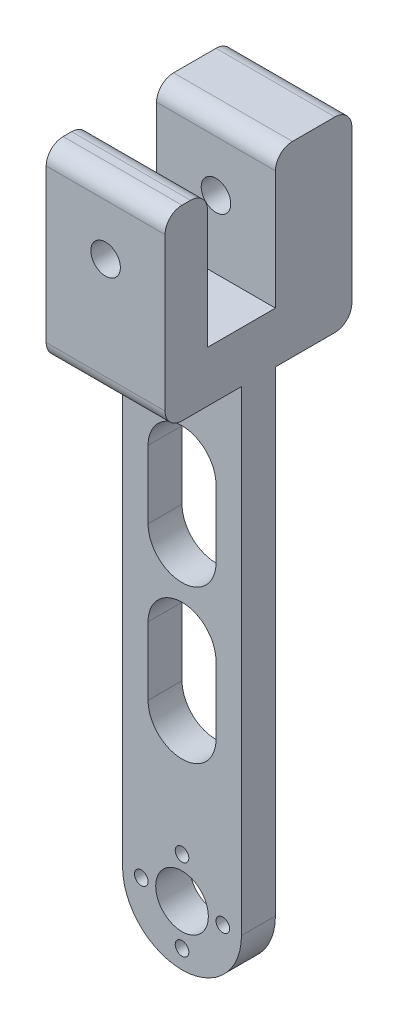
ISO-10303-21;
HEADER;
FILE_DESCRIPTION(('STEP AP214'),'2;1');
FILE_NAME('part.step','',(''),(''),'','','');
FILE_SCHEMA(('AUTOMOTIVE_DESIGN { 1 0 10303 214 1 1 1 1 }'));
ENDSEC;
DATA;
#1=APPLICATION_CONTEXT('core data for automotive mechanical design processes');
#2=APPLICATION_PROTOCOL_DEFINITION('international standard','automotive_design',2000,#1);
#3=PRODUCT_CONTEXT('',#1,'mechanical');
#4=PRODUCT('Part','Part','',(#3));
#5=PRODUCT_RELATED_PRODUCT_CATEGORY('part','',(#4));
#6=PRODUCT_DEFINITION_FORMATION('','',#4);
#7=PRODUCT_DEFINITION_CONTEXT('part definition',#1,'design');
#8=PRODUCT_DEFINITION('design','',#6,#7);
#9=PRODUCT_DEFINITION_SHAPE('','',#8);
#10=(LENGTH_UNIT() NAMED_UNIT(*) SI_UNIT(.MILLI.,.METRE.));
#11=(NAMED_UNIT(*) PLANE_ANGLE_UNIT() SI_UNIT($,.RADIAN.));
#12=(NAMED_UNIT(*) SI_UNIT($,.STERADIAN.) SOLID_ANGLE_UNIT());
#13=UNCERTAINTY_MEASURE_WITH_UNIT(LENGTH_MEASURE(1.E-05),#10,'distance_accuracy_value','');
#14=(GEOMETRIC_REPRESENTATION_CONTEXT(3) GLOBAL_UNCERTAINTY_ASSIGNED_CONTEXT((#13)) GLOBAL_UNIT_ASSIGNED_CONTEXT((#10,
#11,#12)) REPRESENTATION_CONTEXT('',''));
#15=CARTESIAN_POINT('',(0.,0.,0.));
#16=DIRECTION('',(0.,0.,1.));
#17=DIRECTION('',(1.,0.,0.));
#18=AXIS2_PLACEMENT_3D('',#15,#16,#17);
#19=CARTESIAN_POINT('',(17.5,97.5,5.));
#20=DIRECTION('',(0.,-1.,0.));
#21=DIRECTION('',(0.,0.,-1.));
#22=AXIS2_PLACEMENT_3D('',#19,#20,#21);
#23=PLANE('',#22);
#24=DIRECTION('',(-1.,0.,0.));
#25=VECTOR('',#24,1.);
#26=CARTESIAN_POINT('',(67.5,97.5,20.));
#27=LINE('',#26,#25);
#28=CARTESIAN_POINT('',(17.5,97.5,20.));
#29=VERTEX_POINT('',#28);
#30=CARTESIAN_POINT('',(-17.5,97.5,20.));
#31=VERTEX_POINT('',#30);
#32=EDGE_CURVE('E313',#29,#31,#27,.T.);
#33=ORIENTED_EDGE('',*,*,#32,.T.);
#34=DIRECTION('',(0.,0.,-1.));
#35=VECTOR('',#34,1.);
#36=CARTESIAN_POINT('',(-17.5,97.5,5.));
#37=LINE('',#36,#35);
#38=CARTESIAN_POINT('',(-17.5,97.5,22.5));
#39=VERTEX_POINT('',#38);
#40=EDGE_CURVE('E407',#39,#31,#37,.T.);
#41=ORIENTED_EDGE('',*,*,#40,.F.);
#42=DIRECTION('',(-1.,0.,0.));
#43=VECTOR('',#42,1.);
#44=CARTESIAN_POINT('',(17.5,97.5,22.5));
#45=LINE('',#44,#43);
#46=CARTESIAN_POINT('',(17.5,97.5,22.5));
#47=VERTEX_POINT('',#46);
#48=EDGE_CURVE('E345',#47,#39,#45,.T.);
#49=ORIENTED_EDGE('',*,*,#48,.F.);
#50=DIRECTION('',(0.,0.,-1.));
#51=VECTOR('',#50,1.);
#52=CARTESIAN_POINT('',(17.5,97.5,5.));
#53=LINE('',#52,#51);
#54=EDGE_CURVE('E411',#47,#29,#53,.T.);
#55=ORIENTED_EDGE('',*,*,#54,.T.);
#56=EDGE_LOOP('',(#33,#41,#49,#55));
#57=FACE_BOUND('',#56,.T.);
#58=ADVANCED_FACE('F33',(#57),#23,.F.);
#59=CARTESIAN_POINT('',(0.,-97.5,5.));
#60=DIRECTION('',(0.,0.,1.));
#61=DIRECTION('',(1.,0.,0.));
#62=AXIS2_PLACEMENT_3D('',#59,#60,#61);
#63=PLANE('',#62);
#64=CARTESIAN_POINT('',(-12.,-97.5,5.));
#65=DIRECTION('',(0.,0.,1.));
#66=DIRECTION('',(1.,0.,0.));
#67=AXIS2_PLACEMENT_3D('',#64,#65,#66);
#68=CIRCLE('',#67,2.);
#69=CARTESIAN_POINT('',(-10.,-97.5,5.));
#70=VERTEX_POINT('',#69);
#71=EDGE_CURVE('E234',#70,#70,#68,.T.);
#72=ORIENTED_EDGE('',*,*,#71,.F.);
#73=EDGE_LOOP('',(#72));
#74=FACE_BOUND('',#73,.T.);
#75=CARTESIAN_POINT('',(0.,-109.5,5.));
#76=DIRECTION('',(0.,0.,1.));
#77=DIRECTION('',(1.,0.,0.));
#78=AXIS2_PLACEMENT_3D('',#75,#76,#77);
#79=CIRCLE('',#78,1.99999999999999);
#80=CARTESIAN_POINT('',(2.00000000000003,-109.5,5.));
#81=VERTEX_POINT('',#80);
#82=EDGE_CURVE('E859',#81,#81,#79,.T.);
#83=ORIENTED_EDGE('',*,*,#82,.F.);
#84=EDGE_LOOP('',(#83));
#85=FACE_BOUND('',#84,.T.);
#86=CARTESIAN_POINT('',(12.,-97.4999999999999,5.));
#87=DIRECTION('',(0.,0.,1.));
#88=DIRECTION('',(1.,0.,0.));
#89=AXIS2_PLACEMENT_3D('',#86,#87,#88);
#90=CIRCLE('',#89,2.);
#91=CARTESIAN_POINT('',(14.,-97.4999999999999,5.));
#92=VERTEX_POINT('',#91);
#93=EDGE_CURVE('E857',#92,#92,#90,.T.);
#94=ORIENTED_EDGE('',*,*,#93,.F.);
#95=EDGE_LOOP('',(#94));
#96=FACE_BOUND('',#95,.T.);
#97=CARTESIAN_POINT('',(-1.2490009027033E-13,-85.5,5.));
#98=DIRECTION('',(0.,0.,1.));
#99=DIRECTION('',(1.,0.,0.));
#100=AXIS2_PLACEMENT_3D('',#97,#98,#99);
#101=CIRCLE('',#100,1.99999999999999);
#102=CARTESIAN_POINT('',(1.99999999999986,-85.5,5.));
#103=VERTEX_POINT('',#102);
#104=EDGE_CURVE('E854',#103,#103,#101,.T.);
#105=ORIENTED_EDGE('',*,*,#104,.F.);
#106=EDGE_LOOP('',(#105));
#107=FACE_BOUND('',#106,.T.);
#108=CARTESIAN_POINT('',(0.,-97.5,5.));
#109=DIRECTION('',(0.,0.,1.));
#110=DIRECTION('',(1.,0.,0.));
#111=AXIS2_PLACEMENT_3D('',#108,#109,#110);
#112=CIRCLE('',#111,7.75);
#113=CARTESIAN_POINT('',(7.75,-97.5,5.));
#114=VERTEX_POINT('',#113);
#115=EDGE_CURVE('E843',#114,#114,#112,.T.);
#116=ORIENTED_EDGE('',*,*,#115,.F.);
#117=EDGE_LOOP('',(#116));
#118=FACE_BOUND('',#117,.T.);
#119=CARTESIAN_POINT('',(0.,13.7561815674927,5.));
#120=DIRECTION('',(0.,0.,1.));
#121=DIRECTION('',(1.,0.,0.));
#122=AXIS2_PLACEMENT_3D('',#119,#120,#121);
#123=CIRCLE('',#122,10.);
#124=CARTESIAN_POINT('',(10.,13.7561815674927,5.));
#125=VERTEX_POINT('',#124);
#126=CARTESIAN_POINT('',(-10.,13.7561815674927,5.));
#127=VERTEX_POINT('',#126);
#128=EDGE_CURVE('E49',#125,#127,#123,.T.);
#129=ORIENTED_EDGE('',*,*,#128,.F.);
#130=DIRECTION('',(0.,1.,0.));
#131=VECTOR('',#130,1.);
#132=CARTESIAN_POINT('',(10.,13.7561815674927,5.));
#133=LINE('',#132,#131);
#134=CARTESIAN_POINT('',(10.,-6.24381843250733,5.));
#135=VERTEX_POINT('',#134);
#136=EDGE_CURVE('E228',#135,#125,#133,.T.);
#137=ORIENTED_EDGE('',*,*,#136,.F.);
#138=CARTESIAN_POINT('',(0.,-6.24381843250733,5.));
#139=DIRECTION('',(0.,0.,1.));
#140=DIRECTION('',(1.,0.,0.));
#141=AXIS2_PLACEMENT_3D('',#138,#139,#140);
#142=CIRCLE('',#141,10.);
#143=CARTESIAN_POINT('',(-9.99999999999999,-6.24381843250733,5.));
#144=VERTEX_POINT('',#143);
#145=EDGE_CURVE('E231',#144,#135,#142,.T.);
#146=ORIENTED_EDGE('',*,*,#145,.F.);
#147=DIRECTION('',(0.,-1.,0.));
#148=VECTOR('',#147,1.);
#149=CARTESIAN_POINT('',(-10.,13.7561815674927,5.));
#150=LINE('',#149,#148);
#151=EDGE_CURVE('E240',#127,#144,#150,.T.);
#152=ORIENTED_EDGE('',*,*,#151,.F.);
#153=EDGE_LOOP('',(#129,#137,#146,#152));
#154=FACE_BOUND('',#153,.T.);
#155=CARTESIAN_POINT('',(0.,-31.2438184325073,5.));
#156=DIRECTION('',(0.,0.,1.));
#157=DIRECTION('',(1.,0.,0.));
#158=AXIS2_PLACEMENT_3D('',#155,#156,#157);
#159=CIRCLE('',#158,10.);
#160=CARTESIAN_POINT('',(10.,-31.2438184325073,5.));
#161=VERTEX_POINT('',#160);
#162=CARTESIAN_POINT('',(-9.99999999999999,-31.2438184325073,5.));
#163=VERTEX_POINT('',#162);
#164=EDGE_CURVE('E57',#161,#163,#159,.T.);
#165=ORIENTED_EDGE('',*,*,#164,.F.);
#166=DIRECTION('',(0.,1.,0.));
#167=VECTOR('',#166,1.);
#168=CARTESIAN_POINT('',(10.,-31.2438184325073,5.));
#169=LINE('',#168,#167);
#170=CARTESIAN_POINT('',(10.,-51.2438184325073,5.));
#171=VERTEX_POINT('',#170);
#172=EDGE_CURVE('E255',#171,#161,#169,.T.);
#173=ORIENTED_EDGE('',*,*,#172,.F.);
#174=CARTESIAN_POINT('',(0.,-51.2438184325073,5.));
#175=DIRECTION('',(0.,0.,1.));
#176=DIRECTION('',(1.,0.,0.));
#177=AXIS2_PLACEMENT_3D('',#174,#175,#176);
#178=CIRCLE('',#177,10.);
#179=CARTESIAN_POINT('',(-9.99999999999999,-51.2438184325073,5.));
#180=VERTEX_POINT('',#179);
#181=EDGE_CURVE('E269',#180,#171,#178,.T.);
#182=ORIENTED_EDGE('',*,*,#181,.F.);
#183=DIRECTION('',(0.,-1.,0.));
#184=VECTOR('',#183,1.);
#185=CARTESIAN_POINT('',(-9.99999999999999,-31.2438184325073,5.));
#186=LINE('',#185,#184);
#187=EDGE_CURVE('E266',#163,#180,#186,.T.);
#188=ORIENTED_EDGE('',*,*,#187,.F.);
#189=EDGE_LOOP('',(#165,#173,#182,#188));
#190=FACE_BOUND('',#189,.T.);
#191=DIRECTION('',(0.,1.,0.));
#192=VECTOR('',#191,1.);
#193=CARTESIAN_POINT('',(17.5,97.5,5.));
#194=LINE('',#193,#192);
#195=CARTESIAN_POINT('',(17.5,-97.5,5.));
#196=VERTEX_POINT('',#195);
#197=CARTESIAN_POINT('',(17.5,42.5,5.));
#198=VERTEX_POINT('',#197);
#199=EDGE_CURVE('E392',#196,#198,#194,.T.);
#200=ORIENTED_EDGE('',*,*,#199,.T.);
#201=DIRECTION('',(-1.,0.,0.));
#202=VECTOR('',#201,1.);
#203=CARTESIAN_POINT('',(0.,42.5,5.));
#204=LINE('',#203,#202);
#205=CARTESIAN_POINT('',(-17.5,42.5,5.00000000000001));
#206=VERTEX_POINT('',#205);
#207=EDGE_CURVE('E385',#198,#206,#204,.T.);
#208=ORIENTED_EDGE('',*,*,#207,.T.);
#209=DIRECTION('',(0.,-1.,0.));
#210=VECTOR('',#209,1.);
#211=CARTESIAN_POINT('',(-17.5,97.5,5.));
#212=LINE('',#211,#210);
#213=CARTESIAN_POINT('',(-17.5,-97.5,5.));
#214=VERTEX_POINT('',#213);
#215=EDGE_CURVE('E395',#206,#214,#212,.T.);
#216=ORIENTED_EDGE('',*,*,#215,.T.);
#217=CARTESIAN_POINT('',(0.,-97.5,5.));
#218=DIRECTION('',(0.,0.,1.));
#219=DIRECTION('',(1.,0.,0.));
#220=AXIS2_PLACEMENT_3D('',#217,#218,#219);
#221=CIRCLE('',#220,17.5);
#222=EDGE_CURVE('E389',#214,#196,#221,.T.);
#223=ORIENTED_EDGE('',*,*,#222,.T.);
#224=EDGE_LOOP('',(#200,#208,#216,#223));
#225=FACE_BOUND('',#224,.T.);
#226=ADVANCED_FACE('F495',(#74,#85,#96,#107,#118,#154,#190,#225),#63,.T.);
#227=CARTESIAN_POINT('',(0.,-97.5,-5.));
#228=DIRECTION('',(0.,0.,1.));
#229=DIRECTION('',(1.,0.,0.));
#230=AXIS2_PLACEMENT_3D('',#227,#228,#229);
#231=PLANE('',#230);
#232=CARTESIAN_POINT('',(-12.,-97.5,-5.));
#233=DIRECTION('',(0.,0.,-1.));
#234=DIRECTION('',(-1.,0.,0.));
#235=AXIS2_PLACEMENT_3D('',#232,#233,#234);
#236=CIRCLE('',#235,2.);
#237=CARTESIAN_POINT('',(-14.,-97.5,-5.));
#238=VERTEX_POINT('',#237);
#239=EDGE_CURVE('E838',#238,#238,#236,.T.);
#240=ORIENTED_EDGE('',*,*,#239,.F.);
#241=EDGE_LOOP('',(#240));
#242=FACE_BOUND('',#241,.T.);
#243=CARTESIAN_POINT('',(0.,-109.5,-5.));
#244=DIRECTION('',(0.,0.,-1.));
#245=DIRECTION('',(-1.,0.,0.));
#246=AXIS2_PLACEMENT_3D('',#243,#244,#245);
#247=CIRCLE('',#246,1.99999999999999);
#248=CARTESIAN_POINT('',(-1.99999999999995,-109.5,-5.));
#249=VERTEX_POINT('',#248);
#250=EDGE_CURVE('E840',#249,#249,#247,.T.);
#251=ORIENTED_EDGE('',*,*,#250,.F.);
#252=EDGE_LOOP('',(#251));
#253=FACE_BOUND('',#252,.T.);
#254=CARTESIAN_POINT('',(12.,-97.4999999999999,-5.));
#255=DIRECTION('',(0.,0.,-1.));
#256=DIRECTION('',(-1.,0.,0.));
#257=AXIS2_PLACEMENT_3D('',#254,#255,#256);
#258=CIRCLE('',#257,2.);
#259=CARTESIAN_POINT('',(10.,-97.4999999999999,-5.));
#260=VERTEX_POINT('',#259);
#261=EDGE_CURVE('E846',#260,#260,#258,.T.);
#262=ORIENTED_EDGE('',*,*,#261,.F.);
#263=EDGE_LOOP('',(#262));
#264=FACE_BOUND('',#263,.T.);
#265=CARTESIAN_POINT('',(-1.2490009027033E-13,-85.5,-5.));
#266=DIRECTION('',(0.,0.,-1.));
#267=DIRECTION('',(-1.,0.,0.));
#268=AXIS2_PLACEMENT_3D('',#265,#266,#267);
#269=CIRCLE('',#268,1.99999999999999);
#270=CARTESIAN_POINT('',(-2.00000000000011,-85.5,-5.));
#271=VERTEX_POINT('',#270);
#272=EDGE_CURVE('E849',#271,#271,#269,.T.);
#273=ORIENTED_EDGE('',*,*,#272,.F.);
#274=EDGE_LOOP('',(#273));
#275=FACE_BOUND('',#274,.T.);
#276=CARTESIAN_POINT('',(0.,-97.5,-5.));
#277=DIRECTION('',(0.,0.,-1.));
#278=DIRECTION('',(-1.,0.,0.));
#279=AXIS2_PLACEMENT_3D('',#276,#277,#278);
#280=CIRCLE('',#279,7.75);
#281=CARTESIAN_POINT('',(-7.75,-97.5,-5.));
#282=VERTEX_POINT('',#281);
#283=EDGE_CURVE('E839',#282,#282,#280,.T.);
#284=ORIENTED_EDGE('',*,*,#283,.F.);
#285=EDGE_LOOP('',(#284));
#286=FACE_BOUND('',#285,.T.);
#287=DIRECTION('',(0.,1.,0.));
#288=VECTOR('',#287,1.);
#289=CARTESIAN_POINT('',(10.,13.7561815674927,-5.));
#290=LINE('',#289,#288);
#291=CARTESIAN_POINT('',(10.,-6.24381843250733,-5.));
#292=VERTEX_POINT('',#291);
#293=CARTESIAN_POINT('',(10.,13.7561815674927,-5.));
#294=VERTEX_POINT('',#293);
#295=EDGE_CURVE('E215',#292,#294,#290,.T.);
#296=ORIENTED_EDGE('',*,*,#295,.T.);
#297=CARTESIAN_POINT('',(0.,13.7561815674927,-5.));
#298=DIRECTION('',(0.,0.,1.));
#299=DIRECTION('',(1.,0.,0.));
#300=AXIS2_PLACEMENT_3D('',#297,#298,#299);
#301=CIRCLE('',#300,10.);
#302=CARTESIAN_POINT('',(-10.,13.7561815674927,-5.));
#303=VERTEX_POINT('',#302);
#304=EDGE_CURVE('E209',#294,#303,#301,.T.);
#305=ORIENTED_EDGE('',*,*,#304,.T.);
#306=DIRECTION('',(0.,-1.,0.));
#307=VECTOR('',#306,1.);
#308=CARTESIAN_POINT('',(-10.,13.7561815674927,-5.));
#309=LINE('',#308,#307);
#310=CARTESIAN_POINT('',(-9.99999999999999,-6.24381843250732,-5.));
#311=VERTEX_POINT('',#310);
#312=EDGE_CURVE('E219',#303,#311,#309,.T.);
#313=ORIENTED_EDGE('',*,*,#312,.T.);
#314=CARTESIAN_POINT('',(0.,-6.24381843250733,-5.));
#315=DIRECTION('',(0.,0.,1.));
#316=DIRECTION('',(1.,0.,0.));
#317=AXIS2_PLACEMENT_3D('',#314,#315,#316);
#318=CIRCLE('',#317,10.);
#319=EDGE_CURVE('E223',#311,#292,#318,.T.);
#320=ORIENTED_EDGE('',*,*,#319,.T.);
#321=EDGE_LOOP('',(#296,#305,#313,#320));
#322=FACE_BOUND('',#321,.T.);
#323=DIRECTION('',(0.,1.,0.));
#324=VECTOR('',#323,1.);
#325=CARTESIAN_POINT('',(10.,-31.2438184325073,-5.));
#326=LINE('',#325,#324);
#327=CARTESIAN_POINT('',(10.,-51.2438184325073,-5.));
#328=VERTEX_POINT('',#327);
#329=CARTESIAN_POINT('',(10.,-31.2438184325073,-5.));
#330=VERTEX_POINT('',#329);
#331=EDGE_CURVE('E261',#328,#330,#326,.T.);
#332=ORIENTED_EDGE('',*,*,#331,.T.);
#333=CARTESIAN_POINT('',(0.,-31.2438184325073,-5.));
#334=DIRECTION('',(0.,0.,1.));
#335=DIRECTION('',(1.,0.,0.));
#336=AXIS2_PLACEMENT_3D('',#333,#334,#335);
#337=CIRCLE('',#336,10.);
#338=CARTESIAN_POINT('',(-9.99999999999999,-31.2438184325073,-5.));
#339=VERTEX_POINT('',#338);
#340=EDGE_CURVE('E251',#330,#339,#337,.T.);
#341=ORIENTED_EDGE('',*,*,#340,.T.);
#342=DIRECTION('',(0.,-1.,0.));
#343=VECTOR('',#342,1.);
#344=CARTESIAN_POINT('',(-9.99999999999999,-31.2438184325073,-5.));
#345=LINE('',#344,#343);
#346=CARTESIAN_POINT('',(-9.99999999999999,-51.2438184325073,-5.));
#347=VERTEX_POINT('',#346);
#348=EDGE_CURVE('E254',#339,#347,#345,.T.);
#349=ORIENTED_EDGE('',*,*,#348,.T.);
#350=CARTESIAN_POINT('',(0.,-51.2438184325073,-5.));
#351=DIRECTION('',(0.,0.,1.));
#352=DIRECTION('',(1.,0.,0.));
#353=AXIS2_PLACEMENT_3D('',#350,#351,#352);
#354=CIRCLE('',#353,10.);
#355=EDGE_CURVE('E258',#347,#328,#354,.T.);
#356=ORIENTED_EDGE('',*,*,#355,.T.);
#357=EDGE_LOOP('',(#332,#341,#349,#356));
#358=FACE_BOUND('',#357,.T.);
#359=DIRECTION('',(-1.,0.,0.));
#360=VECTOR('',#359,1.);
#361=CARTESIAN_POINT('',(0.,42.5,-5.));
#362=LINE('',#361,#360);
#363=CARTESIAN_POINT('',(17.5,42.5,-4.99999999999999));
#364=VERTEX_POINT('',#363);
#365=CARTESIAN_POINT('',(-17.5,42.5,-5.));
#366=VERTEX_POINT('',#365);
#367=EDGE_CURVE('E11',#364,#366,#362,.T.);
#368=ORIENTED_EDGE('',*,*,#367,.F.);
#369=DIRECTION('',(0.,1.,0.));
#370=VECTOR('',#369,1.);
#371=CARTESIAN_POINT('',(17.5,97.5,-5.));
#372=LINE('',#371,#370);
#373=CARTESIAN_POINT('',(17.5,-97.5,-5.));
#374=VERTEX_POINT('',#373);
#375=EDGE_CURVE('E400',#374,#364,#372,.T.);
#376=ORIENTED_EDGE('',*,*,#375,.F.);
#377=CARTESIAN_POINT('',(0.,-97.5,-5.));
#378=DIRECTION('',(0.,0.,1.));
#379=DIRECTION('',(1.,0.,0.));
#380=AXIS2_PLACEMENT_3D('',#377,#378,#379);
#381=CIRCLE('',#380,17.5);
#382=CARTESIAN_POINT('',(-17.5,-97.5,-5.));
#383=VERTEX_POINT('',#382);
#384=EDGE_CURVE('E388',#383,#374,#381,.T.);
#385=ORIENTED_EDGE('',*,*,#384,.F.);
#386=DIRECTION('',(0.,-1.,0.));
#387=VECTOR('',#386,1.);
#388=CARTESIAN_POINT('',(-17.5,97.5,-5.));
#389=LINE('',#388,#387);
#390=EDGE_CURVE('E393',#366,#383,#389,.T.);
#391=ORIENTED_EDGE('',*,*,#390,.F.);
#392=EDGE_LOOP('',(#368,#376,#385,#391));
#393=FACE_BOUND('',#392,.T.);
#394=ADVANCED_FACE('F225',(#242,#253,#264,#275,#286,#322,#358,#393),#231,.F.);
#395=CARTESIAN_POINT('',(0.,-97.5,5.));
#396=DIRECTION('',(0.,0.,-1.));
#397=DIRECTION('',(-1.,0.,0.));
#398=AXIS2_PLACEMENT_3D('',#395,#396,#397);
#399=CYLINDRICAL_SURFACE('',#398,17.5);
#400=ORIENTED_EDGE('',*,*,#384,.T.);
#401=DIRECTION('',(0.,0.,-1.));
#402=VECTOR('',#401,1.);
#403=CARTESIAN_POINT('',(17.5,-97.5,5.));
#404=LINE('',#403,#402);
#405=EDGE_CURVE('E42',#196,#374,#404,.T.);
#406=ORIENTED_EDGE('',*,*,#405,.F.);
#407=ORIENTED_EDGE('',*,*,#222,.F.);
#408=DIRECTION('',(0.,0.,-1.));
#409=VECTOR('',#408,1.);
#410=CARTESIAN_POINT('',(-17.5,-97.5,5.));
#411=LINE('',#410,#409);
#412=EDGE_CURVE('E397',#214,#383,#411,.T.);
#413=ORIENTED_EDGE('',*,*,#412,.T.);
#414=EDGE_LOOP('',(#400,#406,#407,#413));
#415=FACE_BOUND('',#414,.T.);
#416=ADVANCED_FACE('F35',(#415),#399,.T.);
#417=CARTESIAN_POINT('',(17.5,97.5,5.));
#418=DIRECTION('',(-1.,0.,0.));
#419=DIRECTION('',(0.,-1.,0.));
#420=AXIS2_PLACEMENT_3D('',#417,#418,#419);
#421=PLANE('',#420);
#422=CARTESIAN_POINT('',(17.5,97.5,-10.));
#423=VERTEX_POINT('',#422);
#424=CARTESIAN_POINT('',(17.5,97.5,-22.5));
#425=VERTEX_POINT('',#424);
#426=EDGE_CURVE('E410',#423,#425,#53,.T.);
#427=ORIENTED_EDGE('',*,*,#426,.F.);
#428=CARTESIAN_POINT('',(17.5,92.5,-10.));
#429=DIRECTION('',(-1.,0.,0.));
#430=DIRECTION('',(0.,-1.,0.));
#431=AXIS2_PLACEMENT_3D('',#428,#429,#430);
#432=CIRCLE('',#431,5.);
#433=CARTESIAN_POINT('',(17.5,92.5,-5.));
#434=VERTEX_POINT('',#433);
#435=EDGE_CURVE('E296',#434,#423,#432,.T.);
#436=ORIENTED_EDGE('',*,*,#435,.F.);
#437=DIRECTION('',(0.,1.,0.));
#438=VECTOR('',#437,1.);
#439=CARTESIAN_POINT('',(17.5,92.5,-5.));
#440=LINE('',#439,#438);
#441=CARTESIAN_POINT('',(17.5,57.5,-5.));
#442=VERTEX_POINT('',#441);
#443=EDGE_CURVE('E298',#442,#434,#440,.T.);
#444=ORIENTED_EDGE('',*,*,#443,.F.);
#445=DIRECTION('',(0.,0.,-1.));
#446=VECTOR('',#445,1.);
#447=CARTESIAN_POINT('',(17.5,57.5,-5.));
#448=LINE('',#447,#446);
#449=CARTESIAN_POINT('',(17.5,57.5,15.));
#450=VERTEX_POINT('',#449);
#451=EDGE_CURVE('E289',#450,#442,#448,.T.);
#452=ORIENTED_EDGE('',*,*,#451,.F.);
#453=DIRECTION('',(0.,-1.,0.));
#454=VECTOR('',#453,1.);
#455=CARTESIAN_POINT('',(17.5,57.5,15.));
#456=LINE('',#455,#454);
#457=CARTESIAN_POINT('',(17.5,92.5,15.));
#458=VERTEX_POINT('',#457);
#459=EDGE_CURVE('E291',#458,#450,#456,.T.);
#460=ORIENTED_EDGE('',*,*,#459,.F.);
#461=CARTESIAN_POINT('',(17.5,92.5,20.));
#462=DIRECTION('',(-1.,0.,0.));
#463=DIRECTION('',(0.,-1.,0.));
#464=AXIS2_PLACEMENT_3D('',#461,#462,#463);
#465=CIRCLE('',#464,4.99999999999999);
#466=EDGE_CURVE('E294',#29,#458,#465,.T.);
#467=ORIENTED_EDGE('',*,*,#466,.F.);
#468=ORIENTED_EDGE('',*,*,#54,.F.);
#469=CARTESIAN_POINT('',(17.5,92.5,22.5));
#470=DIRECTION('',(1.,0.,0.));
#471=DIRECTION('',(0.,0.,1.));
#472=AXIS2_PLACEMENT_3D('',#469,#470,#471);
#473=CIRCLE('',#472,5.);
#474=CARTESIAN_POINT('',(17.5,92.5,27.5));
#475=VERTEX_POINT('',#474);
#476=EDGE_CURVE('E326',#47,#475,#473,.T.);
#477=ORIENTED_EDGE('',*,*,#476,.T.);
#478=DIRECTION('',(0.,-1.,0.));
#479=VECTOR('',#478,1.);
#480=CARTESIAN_POINT('',(17.5,92.5,27.5));
#481=LINE('',#480,#479);
#482=CARTESIAN_POINT('',(17.5,47.5,27.5));
#483=VERTEX_POINT('',#482);
#484=EDGE_CURVE('E329',#475,#483,#481,.T.);
#485=ORIENTED_EDGE('',*,*,#484,.T.);
#486=CARTESIAN_POINT('',(17.5,47.5,22.5));
#487=DIRECTION('',(1.,0.,0.));
#488=DIRECTION('',(0.,0.,1.));
#489=AXIS2_PLACEMENT_3D('',#486,#487,#488);
#490=CIRCLE('',#489,5.);
#491=CARTESIAN_POINT('',(17.5,42.5,22.5));
#492=VERTEX_POINT('',#491);
#493=EDGE_CURVE('E332',#483,#492,#490,.T.);
#494=ORIENTED_EDGE('',*,*,#493,.T.);
#495=DIRECTION('',(0.,0.,-1.));
#496=VECTOR('',#495,1.);
#497=CARTESIAN_POINT('',(17.5,42.5,22.5));
#498=LINE('',#497,#496);
#499=EDGE_CURVE('E335',#492,#198,#498,.T.);
#500=ORIENTED_EDGE('',*,*,#499,.T.);
#501=ORIENTED_EDGE('',*,*,#199,.F.);
#502=ORIENTED_EDGE('',*,*,#405,.T.);
#503=ORIENTED_EDGE('',*,*,#375,.T.);
#504=CARTESIAN_POINT('',(17.5,42.5,-22.5));
#505=VERTEX_POINT('',#504);
#506=EDGE_CURVE('E334',#364,#505,#498,.T.);
#507=ORIENTED_EDGE('',*,*,#506,.T.);
#508=CARTESIAN_POINT('',(17.5,47.5,-22.5));
#509=DIRECTION('',(1.,0.,0.));
#510=DIRECTION('',(0.,0.,1.));
#511=AXIS2_PLACEMENT_3D('',#508,#509,#510);
#512=CIRCLE('',#511,5.);
#513=CARTESIAN_POINT('',(17.5,47.5,-27.5));
#514=VERTEX_POINT('',#513);
#515=EDGE_CURVE('E338',#505,#514,#512,.T.);
#516=ORIENTED_EDGE('',*,*,#515,.T.);
#517=DIRECTION('',(0.,1.,0.));
#518=VECTOR('',#517,1.);
#519=CARTESIAN_POINT('',(17.5,92.5,-27.5));
#520=LINE('',#519,#518);
#521=CARTESIAN_POINT('',(17.5,92.5,-27.5));
#522=VERTEX_POINT('',#521);
#523=EDGE_CURVE('E340',#514,#522,#520,.T.);
#524=ORIENTED_EDGE('',*,*,#523,.T.);
#525=CARTESIAN_POINT('',(17.5,92.5,-22.5));
#526=DIRECTION('',(1.,0.,0.));
#527=DIRECTION('',(0.,0.,-1.));
#528=AXIS2_PLACEMENT_3D('',#525,#526,#527);
#529=CIRCLE('',#528,5.);
#530=EDGE_CURVE('E342',#522,#425,#529,.T.);
#531=ORIENTED_EDGE('',*,*,#530,.T.);
#532=EDGE_LOOP('',(#427,#436,#444,#452,#460,#467,#468,#477,#485,#494,#500,#501,#502,#503,#507,
#516,#524,#531));
#533=FACE_BOUND('',#532,.T.);
#534=ADVANCED_FACE('F418',(#533),#421,.F.);
#535=CARTESIAN_POINT('',(-17.5,97.5,-10.));
#536=VERTEX_POINT('',#535);
#537=CARTESIAN_POINT('',(-17.5,97.5,-22.5));
#538=VERTEX_POINT('',#537);
#539=EDGE_CURVE('E406',#536,#538,#37,.T.);
#540=ORIENTED_EDGE('',*,*,#539,.F.);
#541=DIRECTION('',(-1.,0.,0.));
#542=VECTOR('',#541,1.);
#543=CARTESIAN_POINT('',(67.5,97.5,-10.));
#544=LINE('',#543,#542);
#545=EDGE_CURVE('E292',#423,#536,#544,.T.);
#546=ORIENTED_EDGE('',*,*,#545,.F.);
#547=ORIENTED_EDGE('',*,*,#426,.T.);
#548=DIRECTION('',(-1.,0.,0.));
#549=VECTOR('',#548,1.);
#550=CARTESIAN_POINT('',(17.5,97.5,-22.5));
#551=LINE('',#550,#549);
#552=EDGE_CURVE('E364',#425,#538,#551,.T.);
#553=ORIENTED_EDGE('',*,*,#552,.T.);
#554=EDGE_LOOP('',(#540,#546,#547,#553));
#555=FACE_BOUND('',#554,.T.);
#556=ADVANCED_FACE('F449',(#555),#23,.F.);
#557=CARTESIAN_POINT('',(-17.5,97.5,5.));
#558=DIRECTION('',(1.,0.,0.));
#559=DIRECTION('',(0.,1.,0.));
#560=AXIS2_PLACEMENT_3D('',#557,#558,#559);
#561=PLANE('',#560);
#562=DIRECTION('',(0.,-1.,0.));
#563=VECTOR('',#562,1.);
#564=CARTESIAN_POINT('',(-17.5,92.5,-5.));
#565=LINE('',#564,#563);
#566=CARTESIAN_POINT('',(-17.5,92.5,-5.));
#567=VERTEX_POINT('',#566);
#568=CARTESIAN_POINT('',(-17.5,57.5,-5.));
#569=VERTEX_POINT('',#568);
#570=EDGE_CURVE('E300',#567,#569,#565,.T.);
#571=ORIENTED_EDGE('',*,*,#570,.F.);
#572=CARTESIAN_POINT('',(-17.5,92.5,-10.));
#573=DIRECTION('',(1.,0.,0.));
#574=DIRECTION('',(0.,-1.,0.));
#575=AXIS2_PLACEMENT_3D('',#572,#573,#574);
#576=CIRCLE('',#575,5.);
#577=EDGE_CURVE('E288',#536,#567,#576,.T.);
#578=ORIENTED_EDGE('',*,*,#577,.F.);
#579=ORIENTED_EDGE('',*,*,#539,.T.);
#580=CARTESIAN_POINT('',(-17.5,92.5,-22.5));
#581=DIRECTION('',(1.,0.,0.));
#582=DIRECTION('',(0.,0.,-1.));
#583=AXIS2_PLACEMENT_3D('',#580,#581,#582);
#584=CIRCLE('',#583,5.);
#585=CARTESIAN_POINT('',(-17.5,92.5,-27.5));
#586=VERTEX_POINT('',#585);
#587=EDGE_CURVE('E330',#586,#538,#584,.T.);
#588=ORIENTED_EDGE('',*,*,#587,.F.);
#589=DIRECTION('',(0.,1.,0.));
#590=VECTOR('',#589,1.);
#591=CARTESIAN_POINT('',(-17.5,92.5,-27.5));
#592=LINE('',#591,#590);
#593=CARTESIAN_POINT('',(-17.5,47.5,-27.5));
#594=VERTEX_POINT('',#593);
#595=EDGE_CURVE('E358',#594,#586,#592,.T.);
#596=ORIENTED_EDGE('',*,*,#595,.F.);
#597=CARTESIAN_POINT('',(-17.5,47.5,-22.5));
#598=DIRECTION('',(1.,0.,0.));
#599=DIRECTION('',(0.,0.,1.));
#600=AXIS2_PLACEMENT_3D('',#597,#598,#599);
#601=CIRCLE('',#600,5.);
#602=CARTESIAN_POINT('',(-17.5,42.5,-22.5));
#603=VERTEX_POINT('',#602);
#604=EDGE_CURVE('E356',#603,#594,#601,.T.);
#605=ORIENTED_EDGE('',*,*,#604,.F.);
#606=DIRECTION('',(0.,0.,-1.));
#607=VECTOR('',#606,1.);
#608=CARTESIAN_POINT('',(-17.5,42.5,22.5));
#609=LINE('',#608,#607);
#610=EDGE_CURVE('E352',#366,#603,#609,.T.);
#611=ORIENTED_EDGE('',*,*,#610,.F.);
#612=ORIENTED_EDGE('',*,*,#390,.T.);
#613=ORIENTED_EDGE('',*,*,#412,.F.);
#614=ORIENTED_EDGE('',*,*,#215,.F.);
#615=CARTESIAN_POINT('',(-17.5,42.5,22.5));
#616=VERTEX_POINT('',#615);
#617=EDGE_CURVE('E353',#616,#206,#609,.T.);
#618=ORIENTED_EDGE('',*,*,#617,.F.);
#619=CARTESIAN_POINT('',(-17.5,47.5,22.5));
#620=DIRECTION('',(1.,0.,0.));
#621=DIRECTION('',(0.,0.,1.));
#622=AXIS2_PLACEMENT_3D('',#619,#620,#621);
#623=CIRCLE('',#622,5.);
#624=CARTESIAN_POINT('',(-17.5,47.5,27.5));
#625=VERTEX_POINT('',#624);
#626=EDGE_CURVE('E350',#625,#616,#623,.T.);
#627=ORIENTED_EDGE('',*,*,#626,.F.);
#628=DIRECTION('',(0.,-1.,0.));
#629=VECTOR('',#628,1.);
#630=CARTESIAN_POINT('',(-17.5,92.5,27.5));
#631=LINE('',#630,#629);
#632=CARTESIAN_POINT('',(-17.5,92.5,27.5));
#633=VERTEX_POINT('',#632);
#634=EDGE_CURVE('E348',#633,#625,#631,.T.);
#635=ORIENTED_EDGE('',*,*,#634,.F.);
#636=CARTESIAN_POINT('',(-17.5,92.5,22.5));
#637=DIRECTION('',(1.,0.,0.));
#638=DIRECTION('',(0.,0.,1.));
#639=AXIS2_PLACEMENT_3D('',#636,#637,#638);
#640=CIRCLE('',#639,5.);
#641=EDGE_CURVE('E325',#39,#633,#640,.T.);
#642=ORIENTED_EDGE('',*,*,#641,.F.);
#643=ORIENTED_EDGE('',*,*,#40,.T.);
#644=CARTESIAN_POINT('',(-17.5,92.5,20.));
#645=DIRECTION('',(1.,0.,0.));
#646=DIRECTION('',(0.,1.,0.));
#647=AXIS2_PLACEMENT_3D('',#644,#645,#646);
#648=CIRCLE('',#647,4.99999999999999);
#649=CARTESIAN_POINT('',(-17.5,92.5,15.));
#650=VERTEX_POINT('',#649);
#651=EDGE_CURVE('E309',#650,#31,#648,.T.);
#652=ORIENTED_EDGE('',*,*,#651,.F.);
#653=DIRECTION('',(0.,1.,0.));
#654=VECTOR('',#653,1.);
#655=CARTESIAN_POINT('',(-17.5,57.5,15.));
#656=LINE('',#655,#654);
#657=CARTESIAN_POINT('',(-17.5,57.5,15.));
#658=VERTEX_POINT('',#657);
#659=EDGE_CURVE('E306',#658,#650,#656,.T.);
#660=ORIENTED_EDGE('',*,*,#659,.F.);
#661=DIRECTION('',(0.,0.,1.));
#662=VECTOR('',#661,1.);
#663=CARTESIAN_POINT('',(-17.5,57.5,-5.));
#664=LINE('',#663,#662);
#665=EDGE_CURVE('E303',#569,#658,#664,.T.);
#666=ORIENTED_EDGE('',*,*,#665,.F.);
#667=EDGE_LOOP('',(#571,#578,#579,#588,#596,#605,#611,#612,#613,#614,#618,#627,#635,#642,#643,
#652,#660,#666));
#668=FACE_BOUND('',#667,.T.);
#669=ADVANCED_FACE('F456',(#668),#561,.F.);
#670=CARTESIAN_POINT('',(17.5,47.5,-22.5));
#671=DIRECTION('',(-1.,0.,0.));
#672=DIRECTION('',(0.,0.,1.));
#673=AXIS2_PLACEMENT_3D('',#670,#671,#672);
#674=CYLINDRICAL_SURFACE('',#673,5.);
#675=ORIENTED_EDGE('',*,*,#604,.T.);
#676=DIRECTION('',(-1.,0.,0.));
#677=VECTOR('',#676,1.);
#678=CARTESIAN_POINT('',(17.5,47.5,-27.5));
#679=LINE('',#678,#677);
#680=EDGE_CURVE('E370',#514,#594,#679,.T.);
#681=ORIENTED_EDGE('',*,*,#680,.F.);
#682=ORIENTED_EDGE('',*,*,#515,.F.);
#683=DIRECTION('',(-1.,0.,0.));
#684=VECTOR('',#683,1.);
#685=CARTESIAN_POINT('',(17.5,42.5,-22.5));
#686=LINE('',#685,#684);
#687=EDGE_CURVE('E373',#505,#603,#686,.T.);
#688=ORIENTED_EDGE('',*,*,#687,.T.);
#689=EDGE_LOOP('',(#675,#681,#682,#688));
#690=FACE_BOUND('',#689,.T.);
#691=ADVANCED_FACE('F434',(#690),#674,.T.);
#692=CARTESIAN_POINT('',(17.5,92.5,-27.5));
#693=DIRECTION('',(0.,0.,1.));
#694=DIRECTION('',(0.,-1.,0.));
#695=AXIS2_PLACEMENT_3D('',#692,#693,#694);
#696=PLANE('',#695);
#697=CARTESIAN_POINT('',(0.,77.5,-27.5));
#698=DIRECTION('',(0.,0.,-1.));
#699=DIRECTION('',(0.,1.,0.));
#700=AXIS2_PLACEMENT_3D('',#697,#698,#699);
#701=CIRCLE('',#700,4.35);
#702=CARTESIAN_POINT('',(0.,81.85,-27.5));
#703=VERTEX_POINT('',#702);
#704=EDGE_CURVE('E247',#703,#703,#701,.T.);
#705=ORIENTED_EDGE('',*,*,#704,.F.);
#706=EDGE_LOOP('',(#705));
#707=FACE_BOUND('',#706,.T.);
#708=ORIENTED_EDGE('',*,*,#595,.T.);
#709=DIRECTION('',(-1.,0.,0.));
#710=VECTOR('',#709,1.);
#711=CARTESIAN_POINT('',(17.5,92.5,-27.5));
#712=LINE('',#711,#710);
#713=EDGE_CURVE('E367',#522,#586,#712,.T.);
#714=ORIENTED_EDGE('',*,*,#713,.F.);
#715=ORIENTED_EDGE('',*,*,#523,.F.);
#716=ORIENTED_EDGE('',*,*,#680,.T.);
#717=EDGE_LOOP('',(#708,#714,#715,#716));
#718=FACE_BOUND('',#717,.T.);
#719=ADVANCED_FACE('F438',(#707,#718),#696,.F.);
#720=CARTESIAN_POINT('',(17.5,92.5,-22.5));
#721=DIRECTION('',(-1.,0.,0.));
#722=DIRECTION('',(0.,0.,1.));
#723=AXIS2_PLACEMENT_3D('',#720,#721,#722);
#724=CYLINDRICAL_SURFACE('',#723,5.);
#725=ORIENTED_EDGE('',*,*,#587,.T.);
#726=ORIENTED_EDGE('',*,*,#552,.F.);
#727=ORIENTED_EDGE('',*,*,#530,.F.);
#728=ORIENTED_EDGE('',*,*,#713,.T.);
#729=EDGE_LOOP('',(#725,#726,#727,#728));
#730=FACE_BOUND('',#729,.T.);
#731=ADVANCED_FACE('F443',(#730),#724,.T.);
#732=CARTESIAN_POINT('',(17.5,42.5,22.5));
#733=DIRECTION('',(0.,1.,0.));
#734=DIRECTION('',(0.,0.,1.));
#735=AXIS2_PLACEMENT_3D('',#732,#733,#734);
#736=PLANE('',#735);
#737=ORIENTED_EDGE('',*,*,#506,.F.);
#738=ORIENTED_EDGE('',*,*,#367,.T.);
#739=ORIENTED_EDGE('',*,*,#610,.T.);
#740=ORIENTED_EDGE('',*,*,#687,.F.);
#741=EDGE_LOOP('',(#737,#738,#739,#740));
#742=FACE_BOUND('',#741,.T.);
#743=ADVANCED_FACE('F427',(#742),#736,.F.);
#744=CARTESIAN_POINT('',(17.5,92.5,22.5));
#745=DIRECTION('',(-1.,0.,0.));
#746=DIRECTION('',(0.,0.,1.));
#747=AXIS2_PLACEMENT_3D('',#744,#745,#746);
#748=CYLINDRICAL_SURFACE('',#747,5.);
#749=ORIENTED_EDGE('',*,*,#641,.T.);
#750=DIRECTION('',(-1.,0.,0.));
#751=VECTOR('',#750,1.);
#752=CARTESIAN_POINT('',(17.5,92.5,27.5));
#753=LINE('',#752,#751);
#754=EDGE_CURVE('E382',#475,#633,#753,.T.);
#755=ORIENTED_EDGE('',*,*,#754,.F.);
#756=ORIENTED_EDGE('',*,*,#476,.F.);
#757=ORIENTED_EDGE('',*,*,#48,.T.);
#758=EDGE_LOOP('',(#749,#755,#756,#757));
#759=FACE_BOUND('',#758,.T.);
#760=ADVANCED_FACE('F480',(#759),#748,.T.);
#761=CARTESIAN_POINT('',(17.5,92.5,27.5));
#762=DIRECTION('',(0.,0.,-1.));
#763=DIRECTION('',(0.,1.,0.));
#764=AXIS2_PLACEMENT_3D('',#761,#762,#763);
#765=PLANE('',#764);
#766=CARTESIAN_POINT('',(0.,77.5,27.5));
#767=DIRECTION('',(0.,0.,-1.));
#768=DIRECTION('',(0.,1.,0.));
#769=AXIS2_PLACEMENT_3D('',#766,#767,#768);
#770=CIRCLE('',#769,4.35);
#771=CARTESIAN_POINT('',(0.,81.85,27.5));
#772=VERTEX_POINT('',#771);
#773=EDGE_CURVE('E280',#772,#772,#770,.T.);
#774=ORIENTED_EDGE('',*,*,#773,.T.);
#775=EDGE_LOOP('',(#774));
#776=FACE_BOUND('',#775,.T.);
#777=ORIENTED_EDGE('',*,*,#634,.T.);
#778=DIRECTION('',(-1.,0.,0.));
#779=VECTOR('',#778,1.);
#780=CARTESIAN_POINT('',(17.5,47.5,27.5));
#781=LINE('',#780,#779);
#782=EDGE_CURVE('E379',#483,#625,#781,.T.);
#783=ORIENTED_EDGE('',*,*,#782,.F.);
#784=ORIENTED_EDGE('',*,*,#484,.F.);
#785=ORIENTED_EDGE('',*,*,#754,.T.);
#786=EDGE_LOOP('',(#777,#783,#784,#785));
#787=FACE_BOUND('',#786,.T.);
#788=ADVANCED_FACE('F485',(#776,#787),#765,.F.);
#789=CARTESIAN_POINT('',(17.5,47.5,22.5));
#790=DIRECTION('',(-1.,0.,0.));
#791=DIRECTION('',(0.,0.,1.));
#792=AXIS2_PLACEMENT_3D('',#789,#790,#791);
#793=CYLINDRICAL_SURFACE('',#792,5.);
#794=ORIENTED_EDGE('',*,*,#626,.T.);
#795=DIRECTION('',(-1.,0.,0.));
#796=VECTOR('',#795,1.);
#797=CARTESIAN_POINT('',(17.5,42.5,22.5));
#798=LINE('',#797,#796);
#799=EDGE_CURVE('E376',#492,#616,#798,.T.);
#800=ORIENTED_EDGE('',*,*,#799,.F.);
#801=ORIENTED_EDGE('',*,*,#493,.F.);
#802=ORIENTED_EDGE('',*,*,#782,.T.);
#803=EDGE_LOOP('',(#794,#800,#801,#802));
#804=FACE_BOUND('',#803,.T.);
#805=ADVANCED_FACE('F488',(#804),#793,.T.);
#806=ORIENTED_EDGE('',*,*,#207,.F.);
#807=ORIENTED_EDGE('',*,*,#499,.F.);
#808=ORIENTED_EDGE('',*,*,#799,.T.);
#809=ORIENTED_EDGE('',*,*,#617,.T.);
#810=EDGE_LOOP('',(#806,#807,#808,#809));
#811=FACE_BOUND('',#810,.T.);
#812=ADVANCED_FACE('F493',(#811),#736,.F.);
#813=CARTESIAN_POINT('',(67.5,92.5,-10.));
#814=DIRECTION('',(-1.,0.,0.));
#815=DIRECTION('',(0.,-1.,0.));
#816=AXIS2_PLACEMENT_3D('',#813,#814,#815);
#817=CYLINDRICAL_SURFACE('',#816,5.);
#818=ORIENTED_EDGE('',*,*,#435,.T.);
#819=ORIENTED_EDGE('',*,*,#545,.T.);
#820=ORIENTED_EDGE('',*,*,#577,.T.);
#821=DIRECTION('',(-1.,0.,0.));
#822=VECTOR('',#821,1.);
#823=CARTESIAN_POINT('',(67.5,92.5,-5.));
#824=LINE('',#823,#822);
#825=EDGE_CURVE('E311',#434,#567,#824,.T.);
#826=ORIENTED_EDGE('',*,*,#825,.F.);
#827=EDGE_LOOP('',(#818,#819,#820,#826));
#828=FACE_BOUND('',#827,.T.);
#829=ADVANCED_FACE('F452',(#828),#817,.T.);
#830=CARTESIAN_POINT('',(67.5,92.5,20.));
#831=DIRECTION('',(-1.,0.,0.));
#832=DIRECTION('',(0.,-1.,0.));
#833=AXIS2_PLACEMENT_3D('',#830,#831,#832);
#834=CYLINDRICAL_SURFACE('',#833,4.99999999999999);
#835=ORIENTED_EDGE('',*,*,#466,.T.);
#836=DIRECTION('',(-1.,0.,0.));
#837=VECTOR('',#836,1.);
#838=CARTESIAN_POINT('',(67.5,92.5,15.));
#839=LINE('',#838,#837);
#840=EDGE_CURVE('E316',#458,#650,#839,.T.);
#841=ORIENTED_EDGE('',*,*,#840,.T.);
#842=ORIENTED_EDGE('',*,*,#651,.T.);
#843=ORIENTED_EDGE('',*,*,#32,.F.);
#844=EDGE_LOOP('',(#835,#841,#842,#843));
#845=FACE_BOUND('',#844,.T.);
#846=ADVANCED_FACE('F473',(#845),#834,.T.);
#847=CARTESIAN_POINT('',(67.5,57.5,15.));
#848=DIRECTION('',(0.,0.,1.));
#849=DIRECTION('',(0.,-1.,0.));
#850=AXIS2_PLACEMENT_3D('',#847,#848,#849);
#851=PLANE('',#850);
#852=CARTESIAN_POINT('',(0.,77.5,15.));
#853=DIRECTION('',(0.,0.,1.));
#854=DIRECTION('',(0.,-1.,0.));
#855=AXIS2_PLACEMENT_3D('',#852,#853,#854);
#856=CIRCLE('',#855,4.35);
#857=CARTESIAN_POINT('',(0.,73.15,15.));
#858=VERTEX_POINT('',#857);
#859=EDGE_CURVE('E285',#858,#858,#856,.T.);
#860=ORIENTED_EDGE('',*,*,#859,.T.);
#861=EDGE_LOOP('',(#860));
#862=FACE_BOUND('',#861,.T.);
#863=ORIENTED_EDGE('',*,*,#459,.T.);
#864=DIRECTION('',(-1.,0.,0.));
#865=VECTOR('',#864,1.);
#866=CARTESIAN_POINT('',(67.5,57.5,15.));
#867=LINE('',#866,#865);
#868=EDGE_CURVE('E318',#450,#658,#867,.T.);
#869=ORIENTED_EDGE('',*,*,#868,.T.);
#870=ORIENTED_EDGE('',*,*,#659,.T.);
#871=ORIENTED_EDGE('',*,*,#840,.F.);
#872=EDGE_LOOP('',(#863,#869,#870,#871));
#873=FACE_BOUND('',#872,.T.);
#874=ADVANCED_FACE('F469',(#862,#873),#851,.F.);
#875=CARTESIAN_POINT('',(67.5,57.5,-5.));
#876=DIRECTION('',(0.,-1.,0.));
#877=DIRECTION('',(0.,0.,-1.));
#878=AXIS2_PLACEMENT_3D('',#875,#876,#877);
#879=PLANE('',#878);
#880=ORIENTED_EDGE('',*,*,#451,.T.);
#881=DIRECTION('',(-1.,0.,0.));
#882=VECTOR('',#881,1.);
#883=CARTESIAN_POINT('',(67.5,57.5,-5.));
#884=LINE('',#883,#882);
#885=EDGE_CURVE('E320',#442,#569,#884,.T.);
#886=ORIENTED_EDGE('',*,*,#885,.T.);
#887=ORIENTED_EDGE('',*,*,#665,.T.);
#888=ORIENTED_EDGE('',*,*,#868,.F.);
#889=EDGE_LOOP('',(#880,#886,#887,#888));
#890=FACE_BOUND('',#889,.T.);
#891=ADVANCED_FACE('F467',(#890),#879,.F.);
#892=CARTESIAN_POINT('',(67.5,92.5,-5.));
#893=DIRECTION('',(0.,0.,-1.));
#894=DIRECTION('',(0.,1.,0.));
#895=AXIS2_PLACEMENT_3D('',#892,#893,#894);
#896=PLANE('',#895);
#897=CARTESIAN_POINT('',(0.,77.5,-5.));
#898=DIRECTION('',(0.,0.,-1.));
#899=DIRECTION('',(0.,1.,0.));
#900=AXIS2_PLACEMENT_3D('',#897,#898,#899);
#901=CIRCLE('',#900,4.35);
#902=CARTESIAN_POINT('',(0.,81.85,-5.));
#903=VERTEX_POINT('',#902);
#904=EDGE_CURVE('E37',#903,#903,#901,.T.);
#905=ORIENTED_EDGE('',*,*,#904,.T.);
#906=EDGE_LOOP('',(#905));
#907=FACE_BOUND('',#906,.T.);
#908=ORIENTED_EDGE('',*,*,#443,.T.);
#909=ORIENTED_EDGE('',*,*,#825,.T.);
#910=ORIENTED_EDGE('',*,*,#570,.T.);
#911=ORIENTED_EDGE('',*,*,#885,.F.);
#912=EDGE_LOOP('',(#908,#909,#910,#911));
#913=FACE_BOUND('',#912,.T.);
#914=ADVANCED_FACE('F461',(#907,#913),#896,.F.);
#915=CARTESIAN_POINT('',(0.,77.5,27.5));
#916=DIRECTION('',(0.,0.,-1.));
#917=DIRECTION('',(0.,1.,0.));
#918=AXIS2_PLACEMENT_3D('',#915,#916,#917);
#919=CYLINDRICAL_SURFACE('',#918,4.35);
#920=ORIENTED_EDGE('',*,*,#704,.T.);
#921=EDGE_LOOP('',(#920));
#922=FACE_BOUND('',#921,.T.);
#923=ORIENTED_EDGE('',*,*,#904,.F.);
#924=EDGE_LOOP('',(#923));
#925=FACE_BOUND('',#924,.T.);
#926=ADVANCED_FACE('F616',(#922,#925),#919,.F.);
#927=ORIENTED_EDGE('',*,*,#773,.F.);
#928=EDGE_LOOP('',(#927));
#929=FACE_BOUND('',#928,.T.);
#930=ORIENTED_EDGE('',*,*,#859,.F.);
#931=EDGE_LOOP('',(#930));
#932=FACE_BOUND('',#931,.T.);
#933=ADVANCED_FACE('F613',(#929,#932),#919,.F.);
#934=CARTESIAN_POINT('',(0.,-31.2438184325073,-5.));
#935=DIRECTION('',(0.,0.,1.));
#936=DIRECTION('',(1.,0.,0.));
#937=AXIS2_PLACEMENT_3D('',#934,#935,#936);
#938=CYLINDRICAL_SURFACE('',#937,10.);
#939=ORIENTED_EDGE('',*,*,#164,.T.);
#940=DIRECTION('',(0.,0.,1.));
#941=VECTOR('',#940,1.);
#942=CARTESIAN_POINT('',(-9.99999999999999,-31.2438184325073,-5.));
#943=LINE('',#942,#941);
#944=EDGE_CURVE('E264',#339,#163,#943,.T.);
#945=ORIENTED_EDGE('',*,*,#944,.F.);
#946=ORIENTED_EDGE('',*,*,#340,.F.);
#947=DIRECTION('',(0.,0.,1.));
#948=VECTOR('',#947,1.);
#949=CARTESIAN_POINT('',(10.,-31.2438184325073,-5.));
#950=LINE('',#949,#948);
#951=EDGE_CURVE('E241',#330,#161,#950,.T.);
#952=ORIENTED_EDGE('',*,*,#951,.T.);
#953=EDGE_LOOP('',(#939,#945,#946,#952));
#954=FACE_BOUND('',#953,.T.);
#955=ADVANCED_FACE('F603',(#954),#938,.F.);
#956=CARTESIAN_POINT('',(10.,-31.2438184325073,-5.));
#957=DIRECTION('',(1.,0.,0.));
#958=DIRECTION('',(0.,0.,-1.));
#959=AXIS2_PLACEMENT_3D('',#956,#957,#958);
#960=PLANE('',#959);
#961=ORIENTED_EDGE('',*,*,#172,.T.);
#962=ORIENTED_EDGE('',*,*,#951,.F.);
#963=ORIENTED_EDGE('',*,*,#331,.F.);
#964=DIRECTION('',(0.,0.,1.));
#965=VECTOR('',#964,1.);
#966=CARTESIAN_POINT('',(10.,-51.2438184325073,-5.));
#967=LINE('',#966,#965);
#968=EDGE_CURVE('E275',#328,#171,#967,.T.);
#969=ORIENTED_EDGE('',*,*,#968,.T.);
#970=EDGE_LOOP('',(#961,#962,#963,#969));
#971=FACE_BOUND('',#970,.T.);
#972=ADVANCED_FACE('F599',(#971),#960,.F.);
#973=CARTESIAN_POINT('',(0.,-51.2438184325073,-5.));
#974=DIRECTION('',(0.,0.,1.));
#975=DIRECTION('',(1.,0.,0.));
#976=AXIS2_PLACEMENT_3D('',#973,#974,#975);
#977=CYLINDRICAL_SURFACE('',#976,10.);
#978=ORIENTED_EDGE('',*,*,#181,.T.);
#979=ORIENTED_EDGE('',*,*,#968,.F.);
#980=ORIENTED_EDGE('',*,*,#355,.F.);
#981=DIRECTION('',(0.,0.,1.));
#982=VECTOR('',#981,1.);
#983=CARTESIAN_POINT('',(-9.99999999999999,-51.2438184325073,-5.));
#984=LINE('',#983,#982);
#985=EDGE_CURVE('E277',#347,#180,#984,.T.);
#986=ORIENTED_EDGE('',*,*,#985,.T.);
#987=EDGE_LOOP('',(#978,#979,#980,#986));
#988=FACE_BOUND('',#987,.T.);
#989=ADVANCED_FACE('F602',(#988),#977,.F.);
#990=CARTESIAN_POINT('',(-9.99999999999999,-31.2438184325073,-5.));
#991=DIRECTION('',(-1.,0.,0.));
#992=DIRECTION('',(0.,-1.,0.));
#993=AXIS2_PLACEMENT_3D('',#990,#991,#992);
#994=PLANE('',#993);
#995=ORIENTED_EDGE('',*,*,#187,.T.);
#996=ORIENTED_EDGE('',*,*,#985,.F.);
#997=ORIENTED_EDGE('',*,*,#348,.F.);
#998=ORIENTED_EDGE('',*,*,#944,.T.);
#999=EDGE_LOOP('',(#995,#996,#997,#998));
#1000=FACE_BOUND('',#999,.T.);
#1001=ADVANCED_FACE('F598',(#1000),#994,.F.);
#1002=CARTESIAN_POINT('',(0.,13.7561815674927,-5.));
#1003=DIRECTION('',(0.,0.,1.));
#1004=DIRECTION('',(1.,0.,0.));
#1005=AXIS2_PLACEMENT_3D('',#1002,#1003,#1004);
#1006=CYLINDRICAL_SURFACE('',#1005,10.);
#1007=ORIENTED_EDGE('',*,*,#128,.T.);
#1008=DIRECTION('',(0.,0.,1.));
#1009=VECTOR('',#1008,1.);
#1010=CARTESIAN_POINT('',(-10.,13.7561815674927,-5.));
#1011=LINE('',#1010,#1009);
#1012=EDGE_CURVE('E205',#303,#127,#1011,.T.);
#1013=ORIENTED_EDGE('',*,*,#1012,.F.);
#1014=ORIENTED_EDGE('',*,*,#304,.F.);
#1015=DIRECTION('',(0.,0.,1.));
#1016=VECTOR('',#1015,1.);
#1017=CARTESIAN_POINT('',(10.,13.7561815674927,-5.));
#1018=LINE('',#1017,#1016);
#1019=EDGE_CURVE('E245',#294,#125,#1018,.T.);
#1020=ORIENTED_EDGE('',*,*,#1019,.T.);
#1021=EDGE_LOOP('',(#1007,#1013,#1014,#1020));
#1022=FACE_BOUND('',#1021,.T.);
#1023=ADVANCED_FACE('F207',(#1022),#1006,.F.);
#1024=CARTESIAN_POINT('',(10.,13.7561815674927,-5.));
#1025=DIRECTION('',(1.,0.,0.));
#1026=DIRECTION('',(0.,0.,-1.));
#1027=AXIS2_PLACEMENT_3D('',#1024,#1025,#1026);
#1028=PLANE('',#1027);
#1029=ORIENTED_EDGE('',*,*,#136,.T.);
#1030=ORIENTED_EDGE('',*,*,#1019,.F.);
#1031=ORIENTED_EDGE('',*,*,#295,.F.);
#1032=DIRECTION('',(0.,0.,1.));
#1033=VECTOR('',#1032,1.);
#1034=CARTESIAN_POINT('',(10.,-6.24381843250733,-5.));
#1035=LINE('',#1034,#1033);
#1036=EDGE_CURVE('E248',#292,#135,#1035,.T.);
#1037=ORIENTED_EDGE('',*,*,#1036,.T.);
#1038=EDGE_LOOP('',(#1029,#1030,#1031,#1037));
#1039=FACE_BOUND('',#1038,.T.);
#1040=ADVANCED_FACE('F587',(#1039),#1028,.F.);
#1041=CARTESIAN_POINT('',(0.,-6.24381843250733,-5.));
#1042=DIRECTION('',(0.,0.,1.));
#1043=DIRECTION('',(1.,0.,0.));
#1044=AXIS2_PLACEMENT_3D('',#1041,#1042,#1043);
#1045=CYLINDRICAL_SURFACE('',#1044,10.);
#1046=ORIENTED_EDGE('',*,*,#145,.T.);
#1047=ORIENTED_EDGE('',*,*,#1036,.F.);
#1048=ORIENTED_EDGE('',*,*,#319,.F.);
#1049=DIRECTION('',(0.,0.,1.));
#1050=VECTOR('',#1049,1.);
#1051=CARTESIAN_POINT('',(-9.99999999999999,-6.24381843250733,-5.));
#1052=LINE('',#1051,#1050);
#1053=EDGE_CURVE('E214',#311,#144,#1052,.T.);
#1054=ORIENTED_EDGE('',*,*,#1053,.T.);
#1055=EDGE_LOOP('',(#1046,#1047,#1048,#1054));
#1056=FACE_BOUND('',#1055,.T.);
#1057=ADVANCED_FACE('F590',(#1056),#1045,.F.);
#1058=CARTESIAN_POINT('',(-10.,13.7561815674927,-5.));
#1059=DIRECTION('',(-1.,0.,0.));
#1060=DIRECTION('',(0.,-1.,0.));
#1061=AXIS2_PLACEMENT_3D('',#1058,#1059,#1060);
#1062=PLANE('',#1061);
#1063=ORIENTED_EDGE('',*,*,#151,.T.);
#1064=ORIENTED_EDGE('',*,*,#1053,.F.);
#1065=ORIENTED_EDGE('',*,*,#312,.F.);
#1066=ORIENTED_EDGE('',*,*,#1012,.T.);
#1067=EDGE_LOOP('',(#1063,#1064,#1065,#1066));
#1068=FACE_BOUND('',#1067,.T.);
#1069=ADVANCED_FACE('F220',(#1068),#1062,.F.);
#1070=CARTESIAN_POINT('',(0.,-97.5,27.5));
#1071=DIRECTION('',(0.,0.,-1.));
#1072=DIRECTION('',(-1.,0.,0.));
#1073=AXIS2_PLACEMENT_3D('',#1070,#1071,#1072);
#1074=CYLINDRICAL_SURFACE('',#1073,7.75);
#1075=ORIENTED_EDGE('',*,*,#115,.T.);
#1076=EDGE_LOOP('',(#1075));
#1077=FACE_BOUND('',#1076,.T.);
#1078=ORIENTED_EDGE('',*,*,#283,.T.);
#1079=EDGE_LOOP('',(#1078));
#1080=FACE_BOUND('',#1079,.T.);
#1081=ADVANCED_FACE('F533',(#1077,#1080),#1074,.F.);
#1082=CARTESIAN_POINT('',(-1.2490009027033E-13,-85.5,27.5));
#1083=DIRECTION('',(0.,0.,-1.));
#1084=DIRECTION('',(-1.,0.,0.));
#1085=AXIS2_PLACEMENT_3D('',#1082,#1083,#1084);
#1086=CYLINDRICAL_SURFACE('',#1085,1.99999999999999);
#1087=ORIENTED_EDGE('',*,*,#104,.T.);
#1088=EDGE_LOOP('',(#1087));
#1089=FACE_BOUND('',#1088,.T.);
#1090=ORIENTED_EDGE('',*,*,#272,.T.);
#1091=EDGE_LOOP('',(#1090));
#1092=FACE_BOUND('',#1091,.T.);
#1093=ADVANCED_FACE('F538',(#1089,#1092),#1086,.F.);
#1094=CARTESIAN_POINT('',(12.,-97.4999999999999,27.5));
#1095=DIRECTION('',(0.,0.,-1.));
#1096=DIRECTION('',(-1.,0.,0.));
#1097=AXIS2_PLACEMENT_3D('',#1094,#1095,#1096);
#1098=CYLINDRICAL_SURFACE('',#1097,2.);
#1099=ORIENTED_EDGE('',*,*,#93,.T.);
#1100=EDGE_LOOP('',(#1099));
#1101=FACE_BOUND('',#1100,.T.);
#1102=ORIENTED_EDGE('',*,*,#261,.T.);
#1103=EDGE_LOOP('',(#1102));
#1104=FACE_BOUND('',#1103,.T.);
#1105=ADVANCED_FACE('F550',(#1101,#1104),#1098,.F.);
#1106=CARTESIAN_POINT('',(0.,-109.5,27.5));
#1107=DIRECTION('',(0.,0.,-1.));
#1108=DIRECTION('',(-1.,0.,0.));
#1109=AXIS2_PLACEMENT_3D('',#1106,#1107,#1108);
#1110=CYLINDRICAL_SURFACE('',#1109,1.99999999999999);
#1111=ORIENTED_EDGE('',*,*,#82,.T.);
#1112=EDGE_LOOP('',(#1111));
#1113=FACE_BOUND('',#1112,.T.);
#1114=ORIENTED_EDGE('',*,*,#250,.T.);
#1115=EDGE_LOOP('',(#1114));
#1116=FACE_BOUND('',#1115,.T.);
#1117=ADVANCED_FACE('F560',(#1113,#1116),#1110,.F.);
#1118=CARTESIAN_POINT('',(-12.,-97.5,27.5));
#1119=DIRECTION('',(0.,0.,-1.));
#1120=DIRECTION('',(-1.,0.,0.));
#1121=AXIS2_PLACEMENT_3D('',#1118,#1119,#1120);
#1122=CYLINDRICAL_SURFACE('',#1121,2.);
#1123=ORIENTED_EDGE('',*,*,#71,.T.);
#1124=EDGE_LOOP('',(#1123));
#1125=FACE_BOUND('',#1124,.T.);
#1126=ORIENTED_EDGE('',*,*,#239,.T.);
#1127=EDGE_LOOP('',(#1126));
#1128=FACE_BOUND('',#1127,.T.);
#1129=ADVANCED_FACE('F570',(#1125,#1128),#1122,.F.);
#1130=CLOSED_SHELL('',(#58,#226,#394,#416,#534,#556,#669,#691,#719,#731,#743,#760,#788,#805,
#812,#829,#846,#874,#891,#914,#926,#933,#955,#972,#989,#1001,#1023,#1040,#1057,#1069,#1081,
#1093,#1105,#1117,#1129));
#1131=MANIFOLD_SOLID_BREP('B2',#1130);
#1132=ADVANCED_BREP_SHAPE_REPRESENTATION('',(#18,#1131),#14);
#1133=SHAPE_DEFINITION_REPRESENTATION(#9,#1132);
ENDSEC;
END-ISO-10303-21;
